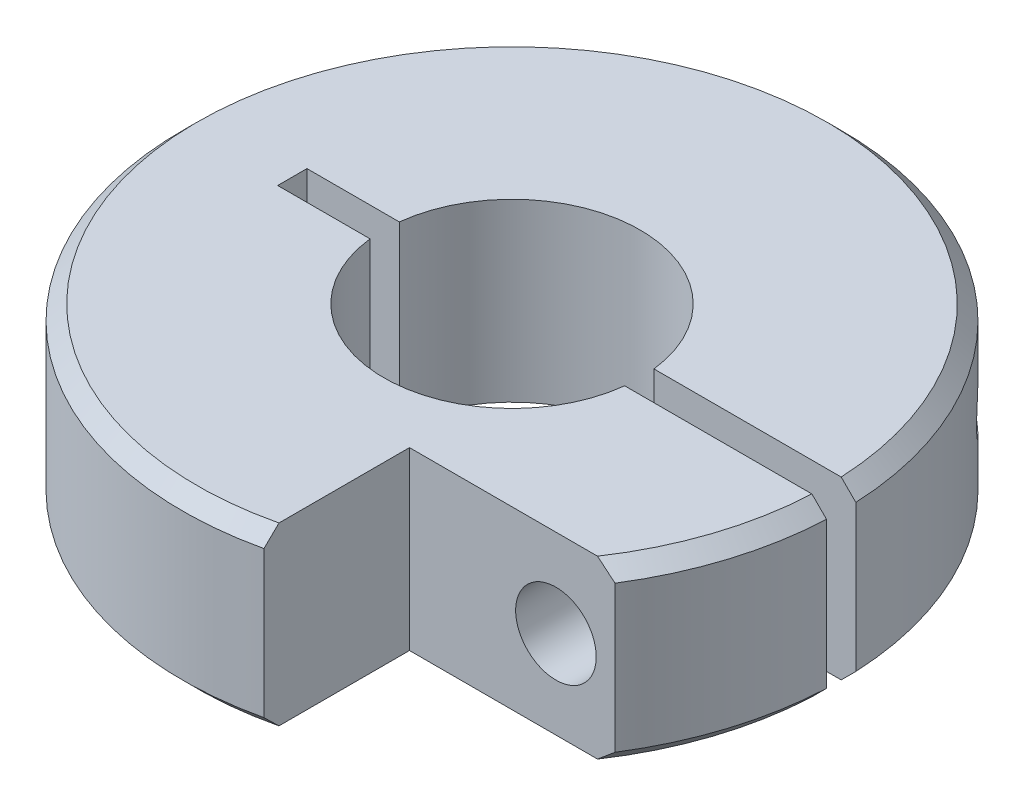
ISO-10303-21;
HEADER;
FILE_DESCRIPTION(('STEP AP214'),'2;1');
FILE_NAME('part.step','',(''),(''),'','','');
FILE_SCHEMA(('AUTOMOTIVE_DESIGN { 1 0 10303 214 1 1 1 1 }'));
ENDSEC;
DATA;
#1=APPLICATION_CONTEXT('core data for automotive mechanical design processes');
#2=APPLICATION_PROTOCOL_DEFINITION('international standard','automotive_design',2000,#1);
#3=PRODUCT_CONTEXT('',#1,'mechanical');
#4=PRODUCT('Part','Part','',(#3));
#5=PRODUCT_RELATED_PRODUCT_CATEGORY('part','',(#4));
#6=PRODUCT_DEFINITION_FORMATION('','',#4);
#7=PRODUCT_DEFINITION_CONTEXT('part definition',#1,'design');
#8=PRODUCT_DEFINITION('design','',#6,#7);
#9=PRODUCT_DEFINITION_SHAPE('','',#8);
#10=(LENGTH_UNIT() NAMED_UNIT(*) SI_UNIT(.MILLI.,.METRE.));
#11=(NAMED_UNIT(*) PLANE_ANGLE_UNIT() SI_UNIT($,.RADIAN.));
#12=(NAMED_UNIT(*) SI_UNIT($,.STERADIAN.) SOLID_ANGLE_UNIT());
#13=UNCERTAINTY_MEASURE_WITH_UNIT(LENGTH_MEASURE(1.E-05),#10,'distance_accuracy_value','');
#14=(GEOMETRIC_REPRESENTATION_CONTEXT(3) GLOBAL_UNCERTAINTY_ASSIGNED_CONTEXT((#13)) GLOBAL_UNIT_ASSIGNED_CONTEXT((#10,
#11,#12)) REPRESENTATION_CONTEXT('',''));
#15=CARTESIAN_POINT('',(0.,0.,0.));
#16=DIRECTION('',(0.,0.,1.));
#17=DIRECTION('',(1.,0.,0.));
#18=AXIS2_PLACEMENT_3D('',#15,#16,#17);
#19=CARTESIAN_POINT('',(-15.,-6.,-1.));
#20=DIRECTION('',(0.,0.,-1.));
#21=DIRECTION('',(-1.,0.,0.));
#22=AXIS2_PLACEMENT_3D('',#19,#20,#21);
#23=PLANE('',#22);
#24=DIRECTION('',(-1.,0.,0.));
#25=VECTOR('',#24,1.);
#26=CARTESIAN_POINT('',(-15.,-6.,-1.));
#27=LINE('',#26,#25);
#28=CARTESIAN_POINT('',(21.4767315949145,-6.,-1.));
#29=VERTEX_POINT('',#28);
#30=CARTESIAN_POINT('',(8.69266932535685,-6.,-1.));
#31=VERTEX_POINT('',#30);
#32=EDGE_CURVE('E196',#29,#31,#27,.T.);
#33=ORIENTED_EDGE('',*,*,#32,.F.);
#34=CARTESIAN_POINT('',(21.4767315949145,-6.,-1.));
#35=CARTESIAN_POINT('',(21.6435747178265,-5.83333726062647,-1.));
#36=CARTESIAN_POINT('',(21.8104158791223,-5.66667255760611,-1.));
#37=CARTESIAN_POINT('',(22.1440942784804,-5.33333922427278,-1.));
#38=CARTESIAN_POINT('',(22.3109315165428,-5.1666705939598,-1.));
#39=CARTESIAN_POINT('',(22.477766792989,-5.,-1.));
#40=B_SPLINE_CURVE_WITH_KNOTS('',3,(#34,#35,#36,#37,#38,#39),.UNSPECIFIED.,.F.,.F.,(4,2,4),(0.,
0.707472873697994,1.41494574739154),.UNSPECIFIED.);
#41=CARTESIAN_POINT('',(22.477766792989,-5.,-1.));
#42=VERTEX_POINT('',#41);
#43=EDGE_CURVE('E11',#29,#42,#40,.T.);
#44=ORIENTED_EDGE('',*,*,#43,.T.);
#45=DIRECTION('',(0.,-1.,0.));
#46=VECTOR('',#45,1.);
#47=CARTESIAN_POINT('',(22.477766792989,6.,-1.));
#48=LINE('',#47,#46);
#49=CARTESIAN_POINT('',(22.477766792989,5.00000000000001,-1.));
#50=VERTEX_POINT('',#49);
#51=EDGE_CURVE('E212',#50,#42,#48,.T.);
#52=ORIENTED_EDGE('',*,*,#51,.F.);
#53=CARTESIAN_POINT('',(22.477766792989,5.00000000000001,-1.));
#54=CARTESIAN_POINT('',(22.3109315165428,5.16667059395981,-1.));
#55=CARTESIAN_POINT('',(22.1440942784804,5.33333922427279,-1.));
#56=CARTESIAN_POINT('',(21.8104158791223,5.66667255760612,-1.));
#57=CARTESIAN_POINT('',(21.6435747178265,5.83333726062647,-1.));
#58=CARTESIAN_POINT('',(21.4767315949146,6.,-1.));
#59=B_SPLINE_CURVE_WITH_KNOTS('',3,(#53,#54,#55,#56,#57,#58),.UNSPECIFIED.,.F.,.F.,(4,2,4),(0.,
0.707472873693528,1.41494574739151),.UNSPECIFIED.);
#60=CARTESIAN_POINT('',(21.4767315949146,6.,-1.));
#61=VERTEX_POINT('',#60);
#62=EDGE_CURVE('E48',#50,#61,#59,.T.);
#63=ORIENTED_EDGE('',*,*,#62,.T.);
#64=DIRECTION('',(-1.,0.,0.));
#65=VECTOR('',#64,1.);
#66=CARTESIAN_POINT('',(-15.,6.,-1.));
#67=LINE('',#66,#65);
#68=CARTESIAN_POINT('',(8.69266932535685,6.,-1.));
#69=VERTEX_POINT('',#68);
#70=EDGE_CURVE('E189',#61,#69,#67,.T.);
#71=ORIENTED_EDGE('',*,*,#70,.T.);
#72=DIRECTION('',(0.,1.,0.));
#73=VECTOR('',#72,1.);
#74=CARTESIAN_POINT('',(8.69266932535685,6.,-1.));
#75=LINE('',#74,#73);
#76=EDGE_CURVE('E228',#31,#69,#75,.T.);
#77=ORIENTED_EDGE('',*,*,#76,.F.);
#78=EDGE_LOOP('',(#33,#44,#52,#63,#71,#77));
#79=FACE_BOUND('',#78,.T.);
#80=CARTESIAN_POINT('',(15.,0.,-0.999999999999999));
#81=DIRECTION('',(0.,0.,1.));
#82=DIRECTION('',(1.,0.,0.));
#83=AXIS2_PLACEMENT_3D('',#80,#81,#82);
#84=CIRCLE('',#83,2.09999999999999);
#85=CARTESIAN_POINT('',(17.1,0.,-0.999999999999999));
#86=VERTEX_POINT('',#85);
#87=EDGE_CURVE('E244',#86,#86,#84,.T.);
#88=ORIENTED_EDGE('',*,*,#87,.F.);
#89=EDGE_LOOP('',(#88));
#90=FACE_BOUND('',#89,.T.);
#91=ADVANCED_FACE('F34',(#79,#90),#23,.F.);
#92=CARTESIAN_POINT('',(0.,6.,0.));
#93=DIRECTION('',(0.,-1.,0.));
#94=DIRECTION('',(0.,0.,-1.));
#95=AXIS2_PLACEMENT_3D('',#92,#93,#94);
#96=CYLINDRICAL_SURFACE('',#95,22.5);
#97=CARTESIAN_POINT('',(17.1,0.,-14.6232691283447));
#98=CARTESIAN_POINT('',(17.0999907068517,0.0903466413831653,-14.623281101206));
#99=CARTESIAN_POINT('',(17.0941017298869,0.18083384085061,-14.6301750558384));
#100=CARTESIAN_POINT('',(17.0711292535924,0.358472284353089,-14.6569721544668));
#101=CARTESIAN_POINT('',(17.0540173287867,0.445614461284299,-14.6769083314716));
#102=CARTESIAN_POINT('',(17.0103430962558,0.61314656186344,-14.72750203973));
#103=CARTESIAN_POINT('',(16.9838738612413,0.693593676493973,-14.7580539320439));
#104=CARTESIAN_POINT('',(16.9231786278574,0.847490636428266,-14.8276147532662));
#105=CARTESIAN_POINT('',(16.8889508759695,0.920938894567488,-14.8666255939123));
#106=CARTESIAN_POINT('',(16.7947522171708,1.09699169506268,-14.9730957354997));
#107=CARTESIAN_POINT('',(16.7306650805494,1.19482527966113,-15.044781224462));
#108=CARTESIAN_POINT('',(16.5919128763551,1.37431386521767,-15.1976690493925));
#109=CARTESIAN_POINT('',(16.5172198574639,1.45592470245298,-15.2788964316422));
#110=CARTESIAN_POINT('',(16.3828736447683,1.58224268511559,-15.4226500142256));
#111=CARTESIAN_POINT('',(16.3251865628618,1.63077133105632,-15.4837221309275));
#112=CARTESIAN_POINT('',(16.20643762037,1.72047903211086,-15.6079717440351));
#113=CARTESIAN_POINT('',(16.1453744141648,1.76165512866196,-15.6711500758721));
#114=CARTESIAN_POINT('',(15.9578652421003,1.87451398983199,-15.8627974585245));
#115=CARTESIAN_POINT('',(15.8270696849547,1.93555477503114,-15.9934112230799));
#116=CARTESIAN_POINT('',(15.5541922426486,2.03081965080315,-16.2589750863797));
#117=CARTESIAN_POINT('',(15.411921190966,2.06440152841425,-16.3939562065425));
#118=CARTESIAN_POINT('',(15.1217382643465,2.10155665912022,-16.6619909189307));
#119=CARTESIAN_POINT('',(14.9738292919466,2.1051451494,-16.7950454555944));
#120=CARTESIAN_POINT('',(14.6909627742403,2.08148346313417,-17.0428104544259));
#121=CARTESIAN_POINT('',(14.5561935073365,2.05728909505948,-17.1580226215562));
#122=CARTESIAN_POINT('',(14.2887198741671,1.98075189021088,-17.381389248059));
#123=CARTESIAN_POINT('',(14.1560134854497,1.92843868173345,-17.489551002056));
#124=CARTESIAN_POINT('',(13.9255408337217,1.80794067436055,-17.6733200409585));
#125=CARTESIAN_POINT('',(13.8263671640633,1.74553473333319,-17.7509454065305));
#126=CARTESIAN_POINT('',(13.6360830334454,1.60123103372033,-17.8975304276612));
#127=CARTESIAN_POINT('',(13.5449626377669,1.51935776423389,-17.9665008056307));
#128=CARTESIAN_POINT('',(13.389975105922,1.35220354782591,-18.0822085895637));
#129=CARTESIAN_POINT('',(13.3241255572501,1.27000070496632,-18.1307260295587));
#130=CARTESIAN_POINT('',(13.2037899557984,1.09318132917792,-18.2185476706411));
#131=CARTESIAN_POINT('',(13.1493005991068,0.998568418576373,-18.2578545508706));
#132=CARTESIAN_POINT('',(13.0543703855541,0.798063562997232,-18.3258525802041));
#133=CARTESIAN_POINT('',(13.0140287180429,0.692098526071347,-18.354468865343));
#134=CARTESIAN_POINT('',(12.9506920918821,0.47259967588363,-18.3992149393326));
#135=CARTESIAN_POINT('',(12.9276844577582,0.3590714594317,-18.415353852461));
#136=CARTESIAN_POINT('',(12.902382585133,0.142779010848019,-18.4330876828353));
#137=CARTESIAN_POINT('',(12.8979046069126,0.0403903748230124,-18.4362161597036));
#138=CARTESIAN_POINT('',(12.9039062453732,-0.163710639760591,-18.4320161930718));
#139=CARTESIAN_POINT('',(12.914380768105,-0.265423236770968,-18.4246913107743));
#140=CARTESIAN_POINT('',(12.9487542938639,-0.460091910045422,-18.4005479627732));
#141=CARTESIAN_POINT('',(12.9719655921137,-0.553232434313017,-18.3842156303367));
#142=CARTESIAN_POINT('',(13.0300865439273,-0.733784612313935,-18.3430669363645));
#143=CARTESIAN_POINT('',(13.0649976158007,-0.821195569941628,-18.3182495462171));
#144=CARTESIAN_POINT('',(13.1470800019225,-0.993100341928133,-18.2594348074928));
#145=CARTESIAN_POINT('',(13.1948144487833,-1.07717753191096,-18.2250119034109));
#146=CARTESIAN_POINT('',(13.2994125342654,-1.23573309387465,-18.1488239759172));
#147=CARTESIAN_POINT('',(13.356279400865,-1.31020805497357,-18.1070563559176));
#148=CARTESIAN_POINT('',(13.4852752675423,-1.45825293310607,-18.0112359571904));
#149=CARTESIAN_POINT('',(13.5584282673595,-1.53034592441853,-17.9562860204403));
#150=CARTESIAN_POINT('',(13.7112429592483,-1.66109651164656,-17.8398734279596));
#151=CARTESIAN_POINT('',(13.7909100316382,-1.7197428460343,-17.7784053758753));
#152=CARTESIAN_POINT('',(13.9925599968847,-1.84803169638001,-17.6204792732211));
#153=CARTESIAN_POINT('',(14.1170180139075,-1.91013993737119,-17.5210248612147));
#154=CARTESIAN_POINT('',(14.3697861480509,-2.00779810719496,-17.3143305840433));
#155=CARTESIAN_POINT('',(14.4981015558286,-2.04330965019013,-17.2070797103858));
#156=CARTESIAN_POINT('',(14.7564939734801,-2.09001528394421,-16.9860284414413));
#157=CARTESIAN_POINT('',(14.8865713097253,-2.1008735845896,-16.8721590250167));
#158=CARTESIAN_POINT('',(15.1439171112205,-2.09901575559403,-16.6415660031443));
#159=CARTESIAN_POINT('',(15.2711845555093,-2.0862911953645,-16.5248413917192));
#160=CARTESIAN_POINT('',(15.5464660585913,-2.03343333455792,-16.2665230314698));
#161=CARTESIAN_POINT('',(15.693379132614,-1.98821202290782,-16.1247405767892));
#162=CARTESIAN_POINT('',(15.9055285607341,-1.89630049190752,-15.9145901985238));
#163=CARTESIAN_POINT('',(15.9749048850505,-1.86162865723638,-15.8449293074549));
#164=CARTESIAN_POINT('',(16.1104547617092,-1.78409145634761,-15.7070864182966));
#165=CARTESIAN_POINT('',(16.1766295363206,-1.74122924843525,-15.6389038613919));
#166=CARTESIAN_POINT('',(16.3321999273506,-1.62728759582677,-15.4766469855257));
#167=CARTESIAN_POINT('',(16.4196939352974,-1.55191327478007,-15.3837072365579));
#168=CARTESIAN_POINT('',(16.5846336370703,-1.38305110713866,-15.2057412994426));
#169=CARTESIAN_POINT('',(16.6620978617388,-1.28959748432205,-15.1207006017837));
#170=CARTESIAN_POINT('',(16.7830454082961,-1.11295984235685,-14.9861636475132));
#171=CARTESIAN_POINT('',(16.8298981070189,-1.03453642368554,-14.9334740063295));
#172=CARTESIAN_POINT('',(16.9146441705048,-0.867673663207643,-14.837415576335));
#173=CARTESIAN_POINT('',(16.9525484335252,-0.779246700952535,-14.7940354554255));
#174=CARTESIAN_POINT('',(17.0101018098449,-0.612811627426877,-14.727795214916));
#175=CARTESIAN_POINT('',(17.0319126467446,-0.536511992088347,-14.7025392341063));
#176=CARTESIAN_POINT('',(17.0669739589941,-0.379527735779115,-14.6618257714046));
#177=CARTESIAN_POINT('',(17.0802458844354,-0.298854658811795,-14.6463437388111));
#178=CARTESIAN_POINT('',(17.0924804321083,-0.181207621285635,-14.6320586265931));
#179=CARTESIAN_POINT('',(17.0952935619191,-0.145112615203342,-14.6287712439558));
#180=CARTESIAN_POINT('',(17.0990554638712,-0.0726860325664491,-14.6243737960057));
#181=CARTESIAN_POINT('',(17.1000037394504,-0.0363543955863428,-14.6232643106102));
#182=CARTESIAN_POINT('',(17.1,0.,-14.6232691283447));
#183=B_SPLINE_CURVE_WITH_KNOTS('',3,(#97,#98,#99,#100,#101,#102,#103,#104,#105,#106,#107,#108,
#109,#110,#111,#112,#113,#114,#115,#116,#117,#118,#119,#120,#121,#122,#123,#124,#125,#126,#127,
#128,#129,#130,#131,#132,#133,#134,#135,#136,#137,#138,#139,#140,#141,#142,#143,#144,#145,#146,
#147,#148,#149,#150,#151,#152,#153,#154,#155,#156,#157,#158,#159,#160,#161,#162,#163,#164,#165,
#166,#167,#168,#169,#170,#171,#172,#173,#174,#175,#176,#177,#178,#179,#180,#181,#182),
.UNSPECIFIED.,.T.,.F.,(4,2,2,2,2,2,2,2,2,2,2,2,2,2,2,2,2,2,2,2,2,2,2,2,2,2,2,2,2,2,2,2,2,2,2,2,
2,2,2,2,2,2,4),(0.,0.270860227261737,0.54240915233951,0.811329773212161,1.08031123410025,
1.48957109816008,1.89993028854066,2.19062103223899,2.4814284835124,3.06288935634311,
3.65758908798731,4.25198668300418,4.78679006430953,5.32103103478863,5.74113160375365,
6.16070647360379,6.50719153394956,6.8535756842181,7.20234193805761,7.55085290913192,
7.85686513391296,8.162773132734,8.45359098728267,8.74444410909702,9.0511021104539,
9.35786874380618,9.70601146347284,10.0544446950257,10.5646326135679,11.0755554523045,
11.5933966192474,12.1114229438762,12.7357373227522,13.0481807486154,13.3605039348288,
13.8038205683908,14.2463060813487,14.5616932742252,14.8766943537899,15.1255828795123,
15.3738437205303,15.4828055896618,15.591796468567),.UNSPECIFIED.);
#184=CARTESIAN_POINT('',(17.1,0.,-14.6232691283447));
#185=VERTEX_POINT('',#184);
#186=EDGE_CURVE('E235',#185,#185,#183,.T.);
#187=ORIENTED_EDGE('',*,*,#186,.T.);
#188=EDGE_LOOP('',(#187));
#189=FACE_BOUND('',#188,.T.);
#190=ORIENTED_EDGE('',*,*,#51,.T.);
#191=CARTESIAN_POINT('',(0.,-5.,0.));
#192=DIRECTION('',(0.,1.,0.));
#193=DIRECTION('',(0.,0.,1.));
#194=AXIS2_PLACEMENT_3D('',#191,#192,#193);
#195=CIRCLE('',#194,22.5);
#196=CARTESIAN_POINT('',(5.,-5.,21.9374109684803));
#197=VERTEX_POINT('',#196);
#198=EDGE_CURVE('E321',#42,#197,#195,.T.);
#199=ORIENTED_EDGE('',*,*,#198,.T.);
#200=DIRECTION('',(0.,1.,0.));
#201=VECTOR('',#200,1.);
#202=CARTESIAN_POINT('',(5.,-6.,21.9374109684803));
#203=LINE('',#202,#201);
#204=CARTESIAN_POINT('',(5.,5.00000000000001,21.9374109684803));
#205=VERTEX_POINT('',#204);
#206=EDGE_CURVE('E169',#197,#205,#203,.T.);
#207=ORIENTED_EDGE('',*,*,#206,.T.);
#208=CARTESIAN_POINT('',(0.,5.00000000000001,0.));
#209=DIRECTION('',(0.,1.,0.));
#210=DIRECTION('',(0.,0.,1.));
#211=AXIS2_PLACEMENT_3D('',#208,#209,#210);
#212=CIRCLE('',#211,22.5);
#213=EDGE_CURVE('E60',#205,#50,#212,.F.);
#214=ORIENTED_EDGE('',*,*,#213,.T.);
#215=EDGE_LOOP('',(#190,#199,#207,#214));
#216=FACE_BOUND('',#215,.T.);
#217=ADVANCED_FACE('F325',(#189,#216),#96,.T.);
#218=CARTESIAN_POINT('',(0.,6.,0.));
#219=DIRECTION('',(0.,1.,0.));
#220=DIRECTION('',(0.,0.,1.));
#221=AXIS2_PLACEMENT_3D('',#218,#219,#220);
#222=CYLINDRICAL_SURFACE('',#221,8.75);
#223=CARTESIAN_POINT('',(0.,6.,0.));
#224=DIRECTION('',(0.,1.,0.));
#225=DIRECTION('',(0.,0.,1.));
#226=AXIS2_PLACEMENT_3D('',#223,#224,#225);
#227=CIRCLE('',#226,8.75);
#228=CARTESIAN_POINT('',(-8.69266932535685,6.,-1.));
#229=VERTEX_POINT('',#228);
#230=EDGE_CURVE('E217',#69,#229,#227,.T.);
#231=ORIENTED_EDGE('',*,*,#230,.T.);
#232=DIRECTION('',(0.,1.,0.));
#233=VECTOR('',#232,1.);
#234=CARTESIAN_POINT('',(-8.69266932535685,6.,-1.));
#235=LINE('',#234,#233);
#236=CARTESIAN_POINT('',(-8.69266932535685,-6.,-1.));
#237=VERTEX_POINT('',#236);
#238=EDGE_CURVE('E231',#229,#237,#235,.F.);
#239=ORIENTED_EDGE('',*,*,#238,.T.);
#240=CARTESIAN_POINT('',(0.,-6.,0.));
#241=DIRECTION('',(0.,1.,0.));
#242=DIRECTION('',(0.,0.,1.));
#243=AXIS2_PLACEMENT_3D('',#240,#241,#242);
#244=CIRCLE('',#243,8.75);
#245=EDGE_CURVE('E221',#31,#237,#244,.T.);
#246=ORIENTED_EDGE('',*,*,#245,.F.);
#247=ORIENTED_EDGE('',*,*,#76,.T.);
#248=EDGE_LOOP('',(#231,#239,#246,#247));
#249=FACE_BOUND('',#248,.T.);
#250=ADVANCED_FACE('F334',(#249),#222,.F.);
#251=DIRECTION('',(0.,1.,0.));
#252=VECTOR('',#251,1.);
#253=CARTESIAN_POINT('',(19.0328663106743,-6.,12.));
#254=LINE('',#253,#252);
#255=CARTESIAN_POINT('',(19.0328663106743,-5.,12.));
#256=VERTEX_POINT('',#255);
#257=CARTESIAN_POINT('',(19.0328663106743,4.99999999999998,12.));
#258=VERTEX_POINT('',#257);
#259=EDGE_CURVE('E170',#256,#258,#254,.T.);
#260=ORIENTED_EDGE('',*,*,#259,.F.);
#261=CARTESIAN_POINT('',(0.,-5.,0.));
#262=DIRECTION('',(0.,1.,0.));
#263=DIRECTION('',(0.,0.,1.));
#264=AXIS2_PLACEMENT_3D('',#261,#262,#263);
#265=CIRCLE('',#264,22.5);
#266=CARTESIAN_POINT('',(22.477766792989,-5.,1.));
#267=VERTEX_POINT('',#266);
#268=EDGE_CURVE('E479',#256,#267,#265,.T.);
#269=ORIENTED_EDGE('',*,*,#268,.T.);
#270=DIRECTION('',(0.,-1.,0.));
#271=VECTOR('',#270,1.);
#272=CARTESIAN_POINT('',(22.477766792989,6.,1.));
#273=LINE('',#272,#271);
#274=CARTESIAN_POINT('',(22.477766792989,4.99999999999998,1.));
#275=VERTEX_POINT('',#274);
#276=EDGE_CURVE('E207',#267,#275,#273,.F.);
#277=ORIENTED_EDGE('',*,*,#276,.T.);
#278=CARTESIAN_POINT('',(0.,4.99999999999998,0.));
#279=DIRECTION('',(0.,1.,0.));
#280=DIRECTION('',(0.,0.,1.));
#281=AXIS2_PLACEMENT_3D('',#278,#279,#280);
#282=CIRCLE('',#281,22.5);
#283=EDGE_CURVE('E234',#275,#258,#282,.F.);
#284=ORIENTED_EDGE('',*,*,#283,.T.);
#285=EDGE_LOOP('',(#260,#269,#277,#284));
#286=FACE_BOUND('',#285,.T.);
#287=ADVANCED_FACE('F246',(#286),#96,.T.);
#288=CARTESIAN_POINT('',(0.,6.,0.));
#289=DIRECTION('',(0.,1.,0.));
#290=DIRECTION('',(0.,0.,1.));
#291=AXIS2_PLACEMENT_3D('',#288,#289,#290);
#292=PLANE('',#291);
#293=DIRECTION('',(-1.,0.,0.));
#294=VECTOR('',#293,1.);
#295=CARTESIAN_POINT('',(19.0328663106743,6.,12.));
#296=LINE('',#295,#294);
#297=CARTESIAN_POINT('',(17.8395627749113,6.,12.));
#298=VERTEX_POINT('',#297);
#299=CARTESIAN_POINT('',(5.,6.,12.));
#300=VERTEX_POINT('',#299);
#301=EDGE_CURVE('E147',#298,#300,#296,.T.);
#302=ORIENTED_EDGE('',*,*,#301,.F.);
#303=CARTESIAN_POINT('',(0.,6.,0.));
#304=DIRECTION('',(0.,1.,0.));
#305=DIRECTION('',(0.,0.,1.));
#306=AXIS2_PLACEMENT_3D('',#303,#304,#305);
#307=CIRCLE('',#306,21.5);
#308=CARTESIAN_POINT('',(21.4767315949145,6.,1.));
#309=VERTEX_POINT('',#308);
#310=EDGE_CURVE('E319',#298,#309,#307,.T.);
#311=ORIENTED_EDGE('',*,*,#310,.T.);
#312=DIRECTION('',(1.,0.,0.));
#313=VECTOR('',#312,1.);
#314=CARTESIAN_POINT('',(-15.,6.,1.));
#315=LINE('',#314,#313);
#316=CARTESIAN_POINT('',(8.69266932535685,6.,1.));
#317=VERTEX_POINT('',#316);
#318=EDGE_CURVE('E199',#317,#309,#315,.T.);
#319=ORIENTED_EDGE('',*,*,#318,.F.);
#320=CARTESIAN_POINT('',(-8.69266932535685,6.,1.));
#321=VERTEX_POINT('',#320);
#322=EDGE_CURVE('E214',#321,#317,#227,.T.);
#323=ORIENTED_EDGE('',*,*,#322,.F.);
#324=CARTESIAN_POINT('',(-15.,6.,1.));
#325=VERTEX_POINT('',#324);
#326=EDGE_CURVE('E200',#325,#321,#315,.T.);
#327=ORIENTED_EDGE('',*,*,#326,.F.);
#328=DIRECTION('',(0.,0.,1.));
#329=VECTOR('',#328,1.);
#330=CARTESIAN_POINT('',(-15.,6.,-1.));
#331=LINE('',#330,#329);
#332=CARTESIAN_POINT('',(-15.,6.,-1.));
#333=VERTEX_POINT('',#332);
#334=EDGE_CURVE('E182',#333,#325,#331,.T.);
#335=ORIENTED_EDGE('',*,*,#334,.F.);
#336=EDGE_CURVE('E202',#229,#333,#67,.T.);
#337=ORIENTED_EDGE('',*,*,#336,.F.);
#338=ORIENTED_EDGE('',*,*,#230,.F.);
#339=ORIENTED_EDGE('',*,*,#70,.F.);
#340=CARTESIAN_POINT('',(0.,6.,0.));
#341=DIRECTION('',(0.,1.,0.));
#342=DIRECTION('',(0.,0.,1.));
#343=AXIS2_PLACEMENT_3D('',#340,#341,#342);
#344=CIRCLE('',#343,21.5);
#345=CARTESIAN_POINT('',(5.,6.,20.9105236663265));
#346=VERTEX_POINT('',#345);
#347=EDGE_CURVE('E176',#61,#346,#344,.T.);
#348=ORIENTED_EDGE('',*,*,#347,.T.);
#349=DIRECTION('',(0.,0.,1.));
#350=VECTOR('',#349,1.);
#351=CARTESIAN_POINT('',(5.,6.,12.));
#352=LINE('',#351,#350);
#353=EDGE_CURVE('E159',#300,#346,#352,.T.);
#354=ORIENTED_EDGE('',*,*,#353,.F.);
#355=EDGE_LOOP('',(#302,#311,#319,#323,#327,#335,#337,#338,#339,#348,#354));
#356=FACE_BOUND('',#355,.T.);
#357=ADVANCED_FACE('F173',(#356),#292,.T.);
#358=CARTESIAN_POINT('',(0.,-6.,0.));
#359=DIRECTION('',(0.,1.,0.));
#360=DIRECTION('',(0.,0.,1.));
#361=AXIS2_PLACEMENT_3D('',#358,#359,#360);
#362=PLANE('',#361);
#363=DIRECTION('',(1.,0.,0.));
#364=VECTOR('',#363,1.);
#365=CARTESIAN_POINT('',(-15.,-6.,1.));
#366=LINE('',#365,#364);
#367=CARTESIAN_POINT('',(8.69266932535685,-6.,1.));
#368=VERTEX_POINT('',#367);
#369=CARTESIAN_POINT('',(21.4767315949145,-6.,1.));
#370=VERTEX_POINT('',#369);
#371=EDGE_CURVE('E188',#368,#370,#366,.T.);
#372=ORIENTED_EDGE('',*,*,#371,.T.);
#373=CARTESIAN_POINT('',(0.,-6.,0.));
#374=DIRECTION('',(0.,1.,0.));
#375=DIRECTION('',(0.,0.,1.));
#376=AXIS2_PLACEMENT_3D('',#373,#374,#375);
#377=CIRCLE('',#376,21.5);
#378=CARTESIAN_POINT('',(17.8395627749113,-6.,12.));
#379=VERTEX_POINT('',#378);
#380=EDGE_CURVE('E311',#370,#379,#377,.F.);
#381=ORIENTED_EDGE('',*,*,#380,.T.);
#382=DIRECTION('',(-1.,0.,0.));
#383=VECTOR('',#382,1.);
#384=CARTESIAN_POINT('',(19.0328663106743,-6.,12.));
#385=LINE('',#384,#383);
#386=CARTESIAN_POINT('',(5.,-6.,12.));
#387=VERTEX_POINT('',#386);
#388=EDGE_CURVE('E177',#379,#387,#385,.T.);
#389=ORIENTED_EDGE('',*,*,#388,.T.);
#390=DIRECTION('',(0.,0.,1.));
#391=VECTOR('',#390,1.);
#392=CARTESIAN_POINT('',(5.,-6.,12.));
#393=LINE('',#392,#391);
#394=CARTESIAN_POINT('',(5.,-6.,20.9105236663265));
#395=VERTEX_POINT('',#394);
#396=EDGE_CURVE('E168',#387,#395,#393,.T.);
#397=ORIENTED_EDGE('',*,*,#396,.T.);
#398=CARTESIAN_POINT('',(0.,-6.,0.));
#399=DIRECTION('',(0.,1.,0.));
#400=DIRECTION('',(0.,0.,1.));
#401=AXIS2_PLACEMENT_3D('',#398,#399,#400);
#402=CIRCLE('',#401,21.5);
#403=EDGE_CURVE('E339',#395,#29,#402,.F.);
#404=ORIENTED_EDGE('',*,*,#403,.T.);
#405=ORIENTED_EDGE('',*,*,#32,.T.);
#406=ORIENTED_EDGE('',*,*,#245,.T.);
#407=CARTESIAN_POINT('',(-15.,-6.,-1.));
#408=VERTEX_POINT('',#407);
#409=EDGE_CURVE('E193',#237,#408,#27,.T.);
#410=ORIENTED_EDGE('',*,*,#409,.T.);
#411=DIRECTION('',(0.,0.,1.));
#412=VECTOR('',#411,1.);
#413=CARTESIAN_POINT('',(-15.,-6.,-1.));
#414=LINE('',#413,#412);
#415=CARTESIAN_POINT('',(-15.,-6.,1.));
#416=VERTEX_POINT('',#415);
#417=EDGE_CURVE('E185',#408,#416,#414,.T.);
#418=ORIENTED_EDGE('',*,*,#417,.T.);
#419=CARTESIAN_POINT('',(-8.69266932535685,-6.,1.));
#420=VERTEX_POINT('',#419);
#421=EDGE_CURVE('E190',#416,#420,#366,.T.);
#422=ORIENTED_EDGE('',*,*,#421,.T.);
#423=EDGE_CURVE('E218',#420,#368,#244,.T.);
#424=ORIENTED_EDGE('',*,*,#423,.T.);
#425=EDGE_LOOP('',(#372,#381,#389,#397,#404,#405,#406,#410,#418,#422,#424));
#426=FACE_BOUND('',#425,.T.);
#427=ADVANCED_FACE('F341',(#426),#362,.F.);
#428=ORIENTED_EDGE('',*,*,#322,.T.);
#429=DIRECTION('',(0.,1.,0.));
#430=VECTOR('',#429,1.);
#431=CARTESIAN_POINT('',(8.69266932535685,6.,1.));
#432=LINE('',#431,#430);
#433=EDGE_CURVE('E225',#317,#368,#432,.F.);
#434=ORIENTED_EDGE('',*,*,#433,.T.);
#435=ORIENTED_EDGE('',*,*,#423,.F.);
#436=DIRECTION('',(0.,1.,0.));
#437=VECTOR('',#436,1.);
#438=CARTESIAN_POINT('',(-8.69266932535685,6.,1.));
#439=LINE('',#438,#437);
#440=EDGE_CURVE('E222',#420,#321,#439,.T.);
#441=ORIENTED_EDGE('',*,*,#440,.T.);
#442=EDGE_LOOP('',(#428,#434,#435,#441));
#443=FACE_BOUND('',#442,.T.);
#444=ADVANCED_FACE('F367',(#443),#222,.F.);
#445=CARTESIAN_POINT('',(-15.,-6.,1.));
#446=DIRECTION('',(0.,0.,1.));
#447=DIRECTION('',(1.,0.,0.));
#448=AXIS2_PLACEMENT_3D('',#445,#446,#447);
#449=PLANE('',#448);
#450=ORIENTED_EDGE('',*,*,#421,.F.);
#451=DIRECTION('',(0.,1.,0.));
#452=VECTOR('',#451,1.);
#453=CARTESIAN_POINT('',(-15.,-6.,1.));
#454=LINE('',#453,#452);
#455=EDGE_CURVE('E208',#416,#325,#454,.T.);
#456=ORIENTED_EDGE('',*,*,#455,.T.);
#457=ORIENTED_EDGE('',*,*,#326,.T.);
#458=ORIENTED_EDGE('',*,*,#440,.F.);
#459=EDGE_LOOP('',(#450,#456,#457,#458));
#460=FACE_BOUND('',#459,.T.);
#461=ADVANCED_FACE('F359',(#460),#449,.F.);
#462=ORIENTED_EDGE('',*,*,#336,.T.);
#463=DIRECTION('',(0.,1.,0.));
#464=VECTOR('',#463,1.);
#465=CARTESIAN_POINT('',(-15.,-6.,-1.));
#466=LINE('',#465,#464);
#467=EDGE_CURVE('E204',#408,#333,#466,.T.);
#468=ORIENTED_EDGE('',*,*,#467,.F.);
#469=ORIENTED_EDGE('',*,*,#409,.F.);
#470=ORIENTED_EDGE('',*,*,#238,.F.);
#471=EDGE_LOOP('',(#462,#468,#469,#470));
#472=FACE_BOUND('',#471,.T.);
#473=ADVANCED_FACE('F351',(#472),#23,.F.);
#474=CARTESIAN_POINT('',(-15.,-6.,-1.));
#475=DIRECTION('',(-1.,0.,0.));
#476=DIRECTION('',(0.,0.,1.));
#477=AXIS2_PLACEMENT_3D('',#474,#475,#476);
#478=PLANE('',#477);
#479=ORIENTED_EDGE('',*,*,#334,.T.);
#480=ORIENTED_EDGE('',*,*,#455,.F.);
#481=ORIENTED_EDGE('',*,*,#417,.F.);
#482=ORIENTED_EDGE('',*,*,#467,.T.);
#483=EDGE_LOOP('',(#479,#480,#481,#482));
#484=FACE_BOUND('',#483,.T.);
#485=ADVANCED_FACE('F358',(#484),#478,.F.);
#486=CARTESIAN_POINT('',(15.,0.,1.));
#487=DIRECTION('',(0.,0.,1.));
#488=DIRECTION('',(1.,0.,0.));
#489=AXIS2_PLACEMENT_3D('',#486,#487,#488);
#490=CIRCLE('',#489,2.74999999999999);
#491=CARTESIAN_POINT('',(17.75,0.,1.));
#492=VERTEX_POINT('',#491);
#493=EDGE_CURVE('E160',#492,#492,#490,.T.);
#494=ORIENTED_EDGE('',*,*,#493,.T.);
#495=EDGE_LOOP('',(#494));
#496=FACE_BOUND('',#495,.T.);
#497=ORIENTED_EDGE('',*,*,#276,.F.);
#498=CARTESIAN_POINT('',(22.477766792989,-5.,1.));
#499=CARTESIAN_POINT('',(22.3109315165428,-5.1666705939598,1.));
#500=CARTESIAN_POINT('',(22.1440942784804,-5.33333922427278,1.));
#501=CARTESIAN_POINT('',(21.8104158791223,-5.66667255760611,1.));
#502=CARTESIAN_POINT('',(21.6435747178265,-5.83333726062647,1.));
#503=CARTESIAN_POINT('',(21.4767315949145,-6.,1.));
#504=B_SPLINE_CURVE_WITH_KNOTS('',3,(#498,#499,#500,#501,#502,#503),.UNSPECIFIED.,.F.,.F.,(4,2,
4),(0.,0.707472873693541,1.41494574739154),.UNSPECIFIED.);
#505=EDGE_CURVE('E381',#267,#370,#504,.T.);
#506=ORIENTED_EDGE('',*,*,#505,.T.);
#507=ORIENTED_EDGE('',*,*,#371,.F.);
#508=ORIENTED_EDGE('',*,*,#433,.F.);
#509=ORIENTED_EDGE('',*,*,#318,.T.);
#510=CARTESIAN_POINT('',(21.4767315949145,6.,1.));
#511=CARTESIAN_POINT('',(21.6435747178265,5.83333726062647,1.));
#512=CARTESIAN_POINT('',(21.8104158791222,5.6666725576061,1.));
#513=CARTESIAN_POINT('',(22.1440942784804,5.33333922427276,1.));
#514=CARTESIAN_POINT('',(22.3109315165428,5.16667059395979,1.));
#515=CARTESIAN_POINT('',(22.477766792989,4.99999999999998,1.));
#516=B_SPLINE_CURVE_WITH_KNOTS('',3,(#510,#511,#512,#513,#514,#515),.UNSPECIFIED.,.F.,.F.,(4,2,
4),(0.,0.707472873698008,1.41494574739156),.UNSPECIFIED.);
#517=EDGE_CURVE('E296',#309,#275,#516,.T.);
#518=ORIENTED_EDGE('',*,*,#517,.T.);
#519=EDGE_LOOP('',(#497,#506,#507,#508,#509,#518));
#520=FACE_BOUND('',#519,.T.);
#521=ADVANCED_FACE('F263',(#496,#520),#449,.F.);
#522=CARTESIAN_POINT('',(5.,-6.,12.));
#523=DIRECTION('',(-1.,0.,0.));
#524=DIRECTION('',(0.,0.,1.));
#525=AXIS2_PLACEMENT_3D('',#522,#523,#524);
#526=PLANE('',#525);
#527=ORIENTED_EDGE('',*,*,#206,.F.);
#528=CARTESIAN_POINT('',(5.,-5.,21.9374109684803));
#529=CARTESIAN_POINT('',(5.,-5.16677261922285,21.7663662638823));
#530=CARTESIAN_POINT('',(5.,-5.33349226198626,21.5952699699237));
#531=CARTESIAN_POINT('',(5.,-5.66682559532006,21.2529742025395));
#532=CARTESIAN_POINT('',(5.,-5.83343928588998,21.0817747291136));
#533=CARTESIAN_POINT('',(5.,-6.,20.9105236663265));
#534=B_SPLINE_CURVE_WITH_KNOTS('',3,(#528,#529,#530,#531,#532,#533),.UNSPECIFIED.,.F.,.F.,(4,2,
4),(0.,0.716675958719119,1.43335192055949),.UNSPECIFIED.);
#535=EDGE_CURVE('E274',#197,#395,#534,.T.);
#536=ORIENTED_EDGE('',*,*,#535,.T.);
#537=ORIENTED_EDGE('',*,*,#396,.F.);
#538=DIRECTION('',(0.,1.,0.));
#539=VECTOR('',#538,1.);
#540=CARTESIAN_POINT('',(5.,-6.,12.));
#541=LINE('',#540,#539);
#542=EDGE_CURVE('E151',#387,#300,#541,.T.);
#543=ORIENTED_EDGE('',*,*,#542,.T.);
#544=ORIENTED_EDGE('',*,*,#353,.T.);
#545=CARTESIAN_POINT('',(5.,6.,20.9105236663265));
#546=CARTESIAN_POINT('',(5.,5.83343928588998,21.0817747291136));
#547=CARTESIAN_POINT('',(5.,5.66682559532006,21.2529742025395));
#548=CARTESIAN_POINT('',(5.,5.33349226198627,21.5952699699237));
#549=CARTESIAN_POINT('',(5.,5.16677261922286,21.7663662638824));
#550=CARTESIAN_POINT('',(5.,5.00000000000001,21.9374109684803));
#551=B_SPLINE_CURVE_WITH_KNOTS('',3,(#545,#546,#547,#548,#549,#550),.UNSPECIFIED.,.F.,.F.,(4,2,
4),(0.,0.71667596184036,1.43335192055947),.UNSPECIFIED.);
#552=EDGE_CURVE('E267',#346,#205,#551,.T.);
#553=ORIENTED_EDGE('',*,*,#552,.T.);
#554=EDGE_LOOP('',(#527,#536,#537,#543,#544,#553));
#555=FACE_BOUND('',#554,.T.);
#556=ADVANCED_FACE('F166',(#555),#526,.F.);
#557=CARTESIAN_POINT('',(19.0328663106743,-6.,12.));
#558=DIRECTION('',(0.,0.,-1.));
#559=DIRECTION('',(-1.,0.,0.));
#560=AXIS2_PLACEMENT_3D('',#557,#558,#559);
#561=PLANE('',#560);
#562=CARTESIAN_POINT('',(15.,0.,12.));
#563=DIRECTION('',(0.,0.,1.));
#564=DIRECTION('',(1.,0.,0.));
#565=AXIS2_PLACEMENT_3D('',#562,#563,#564);
#566=CIRCLE('',#565,2.74999999999999);
#567=CARTESIAN_POINT('',(17.75,0.,12.));
#568=VERTEX_POINT('',#567);
#569=EDGE_CURVE('E243',#568,#568,#566,.T.);
#570=ORIENTED_EDGE('',*,*,#569,.F.);
#571=EDGE_LOOP('',(#570));
#572=FACE_BOUND('',#571,.T.);
#573=ORIENTED_EDGE('',*,*,#388,.F.);
#574=CARTESIAN_POINT('',(17.8395627749113,-6.,12.));
#575=CARTESIAN_POINT('',(18.039237329136,-5.83427674515612,12.));
#576=CARTESIAN_POINT('',(18.2385165802267,-5.668081773685,12.));
#577=CARTESIAN_POINT('',(18.6362844252788,-5.3347484401104,12.));
#578=CARTESIAN_POINT('',(18.8347730194425,-5.16761007824819,12.));
#579=CARTESIAN_POINT('',(19.0328663106743,-5.,12.));
#580=B_SPLINE_CURVE_WITH_KNOTS('',3,(#574,#575,#576,#577,#578,#579),.UNSPECIFIED.,.F.,.F.,(4,2,
4),(0.,0.778458024634604,1.55691585019189),.UNSPECIFIED.);
#581=EDGE_CURVE('E310',#379,#256,#580,.T.);
#582=ORIENTED_EDGE('',*,*,#581,.T.);
#583=ORIENTED_EDGE('',*,*,#259,.T.);
#584=CARTESIAN_POINT('',(19.0328663106743,4.99999999999998,12.));
#585=CARTESIAN_POINT('',(18.8347730194425,5.16761007824817,12.));
#586=CARTESIAN_POINT('',(18.6362844252788,5.33474844011038,12.));
#587=CARTESIAN_POINT('',(18.2385165802267,5.66808177368499,12.));
#588=CARTESIAN_POINT('',(18.039237329136,5.83427674515612,12.));
#589=CARTESIAN_POINT('',(17.8395627749113,6.,12.));
#590=B_SPLINE_CURVE_WITH_KNOTS('',3,(#584,#585,#586,#587,#588,#589),.UNSPECIFIED.,.F.,.F.,(4,2,
4),(0.,0.778457825557297,1.55691585019191),.UNSPECIFIED.);
#591=EDGE_CURVE('E154',#258,#298,#590,.T.);
#592=ORIENTED_EDGE('',*,*,#591,.T.);
#593=ORIENTED_EDGE('',*,*,#301,.T.);
#594=ORIENTED_EDGE('',*,*,#542,.F.);
#595=EDGE_LOOP('',(#573,#582,#583,#592,#593,#594));
#596=FACE_BOUND('',#595,.T.);
#597=ADVANCED_FACE('F150',(#572,#596),#561,.F.);
#598=CARTESIAN_POINT('',(15.,0.,12.));
#599=DIRECTION('',(0.,0.,1.));
#600=DIRECTION('',(1.,0.,0.));
#601=AXIS2_PLACEMENT_3D('',#598,#599,#600);
#602=CYLINDRICAL_SURFACE('',#601,2.74999999999999);
#603=ORIENTED_EDGE('',*,*,#493,.F.);
#604=EDGE_LOOP('',(#603));
#605=FACE_BOUND('',#604,.T.);
#606=ORIENTED_EDGE('',*,*,#569,.T.);
#607=EDGE_LOOP('',(#606));
#608=FACE_BOUND('',#607,.T.);
#609=ADVANCED_FACE('F255',(#605,#608),#602,.F.);
#610=CARTESIAN_POINT('',(15.,0.,-1.));
#611=DIRECTION('',(0.,0.,1.));
#612=DIRECTION('',(1.,0.,0.));
#613=AXIS2_PLACEMENT_3D('',#610,#611,#612);
#614=CYLINDRICAL_SURFACE('',#613,2.09999999999999);
#615=ORIENTED_EDGE('',*,*,#87,.T.);
#616=EDGE_LOOP('',(#615));
#617=FACE_BOUND('',#616,.T.);
#618=ORIENTED_EDGE('',*,*,#186,.F.);
#619=EDGE_LOOP('',(#618));
#620=FACE_BOUND('',#619,.T.);
#621=ADVANCED_FACE('F250',(#617,#620),#614,.F.);
#622=CARTESIAN_POINT('',(0.,-5.,0.));
#623=DIRECTION('',(0.,1.,0.));
#624=DIRECTION('',(0.,0.,1.));
#625=AXIS2_PLACEMENT_3D('',#622,#623,#624);
#626=CONICAL_SURFACE('',#625,22.5,0.78539816339745);
#627=ORIENTED_EDGE('',*,*,#581,.F.);
#628=ORIENTED_EDGE('',*,*,#380,.F.);
#629=ORIENTED_EDGE('',*,*,#505,.F.);
#630=ORIENTED_EDGE('',*,*,#268,.F.);
#631=EDGE_LOOP('',(#627,#628,#629,#630));
#632=FACE_BOUND('',#631,.T.);
#633=ADVANCED_FACE('F254',(#632),#626,.T.);
#634=CARTESIAN_POINT('',(0.,6.,0.));
#635=DIRECTION('',(0.,-1.,0.));
#636=DIRECTION('',(0.,0.,-1.));
#637=AXIS2_PLACEMENT_3D('',#634,#635,#636);
#638=CONICAL_SURFACE('',#637,21.5,0.785398163397445);
#639=ORIENTED_EDGE('',*,*,#591,.F.);
#640=ORIENTED_EDGE('',*,*,#283,.F.);
#641=ORIENTED_EDGE('',*,*,#517,.F.);
#642=ORIENTED_EDGE('',*,*,#310,.F.);
#643=EDGE_LOOP('',(#639,#640,#641,#642));
#644=FACE_BOUND('',#643,.T.);
#645=ADVANCED_FACE('F287',(#644),#638,.T.);
#646=CARTESIAN_POINT('',(0.,-5.,0.));
#647=DIRECTION('',(0.,1.,0.));
#648=DIRECTION('',(0.,0.,1.));
#649=AXIS2_PLACEMENT_3D('',#646,#647,#648);
#650=CONICAL_SURFACE('',#649,22.5,0.78539816339745);
#651=ORIENTED_EDGE('',*,*,#43,.F.);
#652=ORIENTED_EDGE('',*,*,#403,.F.);
#653=ORIENTED_EDGE('',*,*,#535,.F.);
#654=ORIENTED_EDGE('',*,*,#198,.F.);
#655=EDGE_LOOP('',(#651,#652,#653,#654));
#656=FACE_BOUND('',#655,.T.);
#657=ADVANCED_FACE('F283',(#656),#650,.T.);
#658=CARTESIAN_POINT('',(0.,6.,0.));
#659=DIRECTION('',(0.,-1.,0.));
#660=DIRECTION('',(0.,0.,-1.));
#661=AXIS2_PLACEMENT_3D('',#658,#659,#660);
#662=CONICAL_SURFACE('',#661,21.5,0.785398163397441);
#663=ORIENTED_EDGE('',*,*,#62,.F.);
#664=ORIENTED_EDGE('',*,*,#213,.F.);
#665=ORIENTED_EDGE('',*,*,#552,.F.);
#666=ORIENTED_EDGE('',*,*,#347,.F.);
#667=EDGE_LOOP('',(#663,#664,#665,#666));
#668=FACE_BOUND('',#667,.T.);
#669=ADVANCED_FACE('F36',(#668),#662,.T.);
#670=CLOSED_SHELL('',(#91,#217,#250,#287,#357,#427,#444,#461,#473,#485,#521,#556,#597,#609,#621,
#633,#645,#657,#669));
#671=MANIFOLD_SOLID_BREP('B2',#670);
#672=ADVANCED_BREP_SHAPE_REPRESENTATION('',(#18,#671),#14);
#673=SHAPE_DEFINITION_REPRESENTATION(#9,#672);
ENDSEC;
END-ISO-10303-21;
